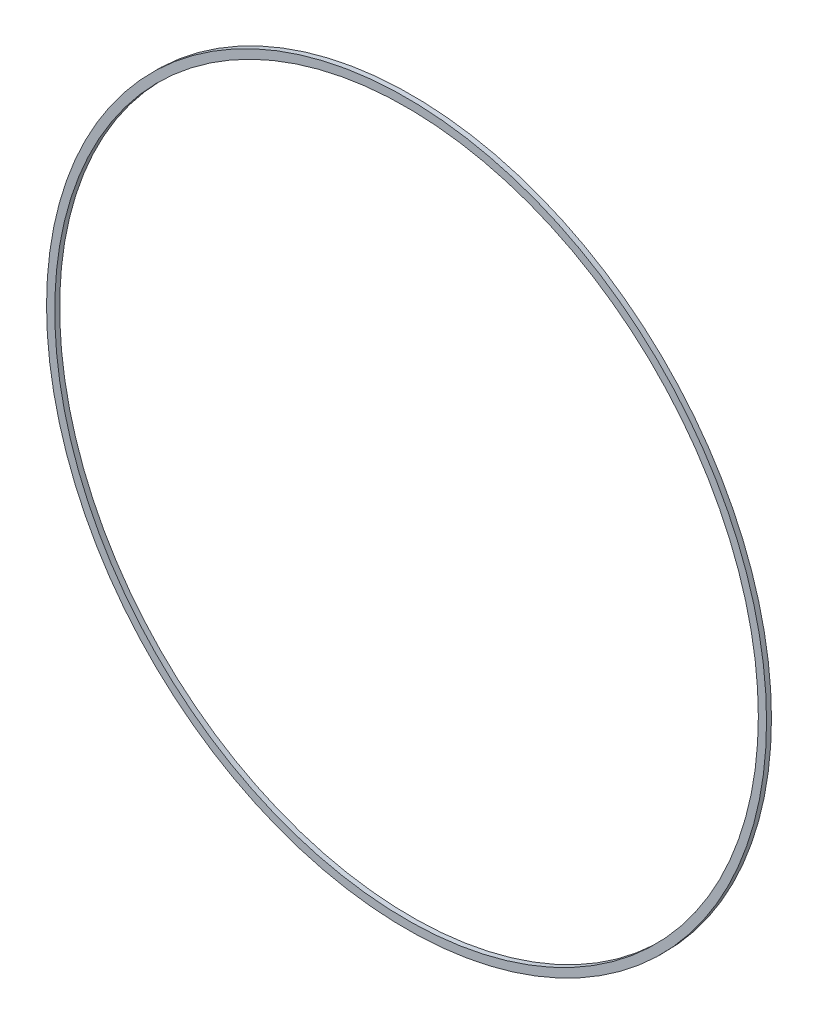
ISO-10303-21;
HEADER;
FILE_DESCRIPTION(('STEP AP214'),'2;1');
FILE_NAME('part.step','',(''),(''),'','','');
FILE_SCHEMA(('AUTOMOTIVE_DESIGN { 1 0 10303 214 1 1 1 1 }'));
ENDSEC;
DATA;
#1=APPLICATION_CONTEXT('core data for automotive mechanical design processes');
#2=APPLICATION_PROTOCOL_DEFINITION('international standard','automotive_design',2000,#1);
#3=PRODUCT_CONTEXT('',#1,'mechanical');
#4=PRODUCT('Part','Part','',(#3));
#5=PRODUCT_RELATED_PRODUCT_CATEGORY('part','',(#4));
#6=PRODUCT_DEFINITION_FORMATION('','',#4);
#7=PRODUCT_DEFINITION_CONTEXT('part definition',#1,'design');
#8=PRODUCT_DEFINITION('design','',#6,#7);
#9=PRODUCT_DEFINITION_SHAPE('','',#8);
#10=(LENGTH_UNIT() NAMED_UNIT(*) SI_UNIT(.MILLI.,.METRE.));
#11=(NAMED_UNIT(*) PLANE_ANGLE_UNIT() SI_UNIT($,.RADIAN.));
#12=(NAMED_UNIT(*) SI_UNIT($,.STERADIAN.) SOLID_ANGLE_UNIT());
#13=UNCERTAINTY_MEASURE_WITH_UNIT(LENGTH_MEASURE(1.E-05),#10,'distance_accuracy_value','');
#14=(GEOMETRIC_REPRESENTATION_CONTEXT(3) GLOBAL_UNCERTAINTY_ASSIGNED_CONTEXT((#13)) GLOBAL_UNIT_ASSIGNED_CONTEXT((#10,
#11,#12)) REPRESENTATION_CONTEXT('',''));
#15=CARTESIAN_POINT('',(0.,0.,0.));
#16=DIRECTION('',(0.,0.,1.));
#17=DIRECTION('',(1.,0.,0.));
#18=AXIS2_PLACEMENT_3D('',#15,#16,#17);
#19=CARTESIAN_POINT('',(0.,0.,0.));
#20=DIRECTION('',(0.,0.,1.));
#21=DIRECTION('',(1.,0.,0.));
#22=AXIS2_PLACEMENT_3D('',#19,#20,#21);
#23=PLANE('',#22);
#24=CARTESIAN_POINT('',(0.,0.,0.));
#25=DIRECTION('',(0.,0.,1.));
#26=DIRECTION('',(1.,0.,0.));
#27=AXIS2_PLACEMENT_3D('',#24,#25,#26);
#28=CIRCLE('',#27,21.45);
#29=CARTESIAN_POINT('',(21.45,0.,0.));
#30=VERTEX_POINT('',#29);
#31=EDGE_CURVE('E11',#30,#30,#28,.T.);
#32=ORIENTED_EDGE('',*,*,#31,.T.);
#33=EDGE_LOOP('',(#32));
#34=FACE_BOUND('',#33,.T.);
#35=CARTESIAN_POINT('',(0.,0.,0.));
#36=DIRECTION('',(0.,0.,1.));
#37=DIRECTION('',(1.,0.,0.));
#38=AXIS2_PLACEMENT_3D('',#35,#36,#37);
#39=CIRCLE('',#38,21.95);
#40=CARTESIAN_POINT('',(21.95,0.,0.));
#41=VERTEX_POINT('',#40);
#42=EDGE_CURVE('E54',#41,#41,#39,.T.);
#43=ORIENTED_EDGE('',*,*,#42,.F.);
#44=EDGE_LOOP('',(#43));
#45=FACE_BOUND('',#44,.T.);
#46=ADVANCED_FACE('F17',(#34,#45),#23,.F.);
#47=CARTESIAN_POINT('',(0.,0.,0.3));
#48=DIRECTION('',(0.,0.,1.));
#49=DIRECTION('',(1.,0.,0.));
#50=AXIS2_PLACEMENT_3D('',#47,#48,#49);
#51=PLANE('',#50);
#52=CARTESIAN_POINT('',(0.,0.,0.3));
#53=DIRECTION('',(0.,0.,1.));
#54=DIRECTION('',(1.,0.,0.));
#55=AXIS2_PLACEMENT_3D('',#52,#53,#54);
#56=CIRCLE('',#55,21.45);
#57=CARTESIAN_POINT('',(21.45,0.,0.3));
#58=VERTEX_POINT('',#57);
#59=EDGE_CURVE('E21',#58,#58,#56,.T.);
#60=ORIENTED_EDGE('',*,*,#59,.F.);
#61=EDGE_LOOP('',(#60));
#62=FACE_BOUND('',#61,.T.);
#63=CARTESIAN_POINT('',(0.,0.,0.3));
#64=DIRECTION('',(0.,0.,1.));
#65=DIRECTION('',(1.,0.,0.));
#66=AXIS2_PLACEMENT_3D('',#63,#64,#65);
#67=CIRCLE('',#66,21.95);
#68=CARTESIAN_POINT('',(21.95,0.,0.3));
#69=VERTEX_POINT('',#68);
#70=EDGE_CURVE('E51',#69,#69,#67,.T.);
#71=ORIENTED_EDGE('',*,*,#70,.T.);
#72=EDGE_LOOP('',(#71));
#73=FACE_BOUND('',#72,.T.);
#74=ADVANCED_FACE('F19',(#62,#73),#51,.T.);
#75=CARTESIAN_POINT('',(0.,0.,0.3));
#76=DIRECTION('',(0.,0.,-1.));
#77=DIRECTION('',(-1.,0.,0.));
#78=AXIS2_PLACEMENT_3D('',#75,#76,#77);
#79=CYLINDRICAL_SURFACE('',#78,21.45);
#80=ORIENTED_EDGE('',*,*,#31,.F.);
#81=EDGE_LOOP('',(#80));
#82=FACE_BOUND('',#81,.T.);
#83=ORIENTED_EDGE('',*,*,#59,.T.);
#84=EDGE_LOOP('',(#83));
#85=FACE_BOUND('',#84,.T.);
#86=ADVANCED_FACE('F73',(#82,#85),#79,.F.);
#87=CARTESIAN_POINT('',(0.,0.,0.3));
#88=DIRECTION('',(0.,0.,-1.));
#89=DIRECTION('',(-1.,0.,0.));
#90=AXIS2_PLACEMENT_3D('',#87,#88,#89);
#91=CYLINDRICAL_SURFACE('',#90,21.95);
#92=ORIENTED_EDGE('',*,*,#42,.T.);
#93=EDGE_LOOP('',(#92));
#94=FACE_BOUND('',#93,.T.);
#95=ORIENTED_EDGE('',*,*,#70,.F.);
#96=EDGE_LOOP('',(#95));
#97=FACE_BOUND('',#96,.T.);
#98=ADVANCED_FACE('F68',(#94,#97),#91,.T.);
#99=CLOSED_SHELL('',(#46,#74,#86,#98));
#100=MANIFOLD_SOLID_BREP('B1',#99);
#101=ADVANCED_BREP_SHAPE_REPRESENTATION('',(#18,#100),#14);
#102=SHAPE_DEFINITION_REPRESENTATION(#9,#101);
ENDSEC;
END-ISO-10303-21;
